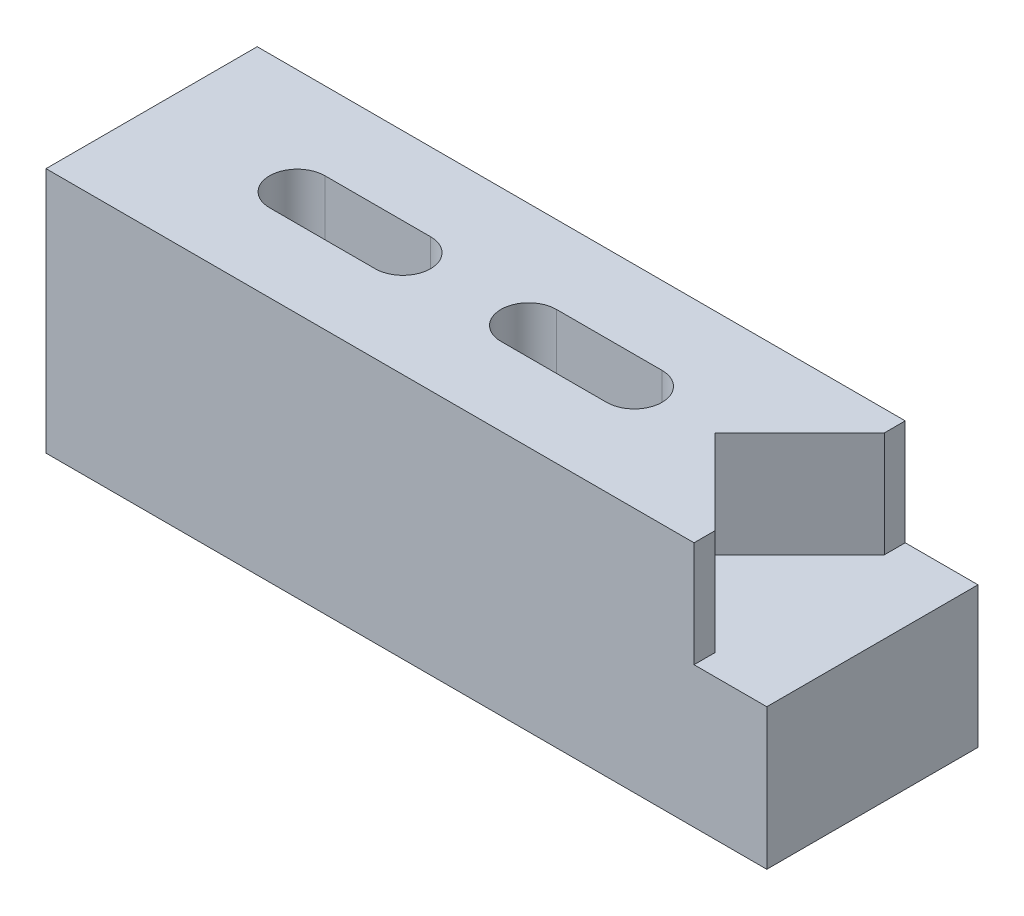
ISO-10303-21;
HEADER;
FILE_DESCRIPTION(('STEP AP214'),'2;1');
FILE_NAME('part.step','',(''),(''),'','','');
FILE_SCHEMA(('AUTOMOTIVE_DESIGN { 1 0 10303 214 1 1 1 1 }'));
ENDSEC;
DATA;
#1=APPLICATION_CONTEXT('core data for automotive mechanical design processes');
#2=APPLICATION_PROTOCOL_DEFINITION('international standard','automotive_design',2000,#1);
#3=PRODUCT_CONTEXT('',#1,'mechanical');
#4=PRODUCT('Part','Part','',(#3));
#5=PRODUCT_RELATED_PRODUCT_CATEGORY('part','',(#4));
#6=PRODUCT_DEFINITION_FORMATION('','',#4);
#7=PRODUCT_DEFINITION_CONTEXT('part definition',#1,'design');
#8=PRODUCT_DEFINITION('design','',#6,#7);
#9=PRODUCT_DEFINITION_SHAPE('','',#8);
#10=(LENGTH_UNIT() NAMED_UNIT(*) SI_UNIT(.MILLI.,.METRE.));
#11=(NAMED_UNIT(*) PLANE_ANGLE_UNIT() SI_UNIT($,.RADIAN.));
#12=(NAMED_UNIT(*) SI_UNIT($,.STERADIAN.) SOLID_ANGLE_UNIT());
#13=UNCERTAINTY_MEASURE_WITH_UNIT(LENGTH_MEASURE(1.E-05),#10,'distance_accuracy_value','');
#14=(GEOMETRIC_REPRESENTATION_CONTEXT(3) GLOBAL_UNCERTAINTY_ASSIGNED_CONTEXT((#13)) GLOBAL_UNIT_ASSIGNED_CONTEXT((#10,
#11,#12)) REPRESENTATION_CONTEXT('',''));
#15=CARTESIAN_POINT('',(0.,0.,0.));
#16=DIRECTION('',(0.,0.,1.));
#17=DIRECTION('',(1.,0.,0.));
#18=AXIS2_PLACEMENT_3D('',#15,#16,#17);
#19=CARTESIAN_POINT('',(0.,17.78,-15.24));
#20=DIRECTION('',(0.,1.,0.));
#21=DIRECTION('',(0.,0.,1.));
#22=AXIS2_PLACEMENT_3D('',#19,#20,#21);
#23=PLANE('',#22);
#24=DIRECTION('',(0.,0.,1.));
#25=VECTOR('',#24,1.);
#26=CARTESIAN_POINT('',(46.76,17.78,-15.24));
#27=LINE('',#26,#25);
#28=CARTESIAN_POINT('',(46.76,17.78,-15.24));
#29=VERTEX_POINT('',#28);
#30=CARTESIAN_POINT('',(46.76,17.78,-13.74));
#31=VERTEX_POINT('',#30);
#32=EDGE_CURVE('E154',#29,#31,#27,.T.);
#33=ORIENTED_EDGE('',*,*,#32,.F.);
#34=DIRECTION('',(-1.,0.,0.));
#35=VECTOR('',#34,1.);
#36=CARTESIAN_POINT('',(0.,17.78,-15.24));
#37=LINE('',#36,#35);
#38=CARTESIAN_POINT('',(0.,17.78,-15.24));
#39=VERTEX_POINT('',#38);
#40=EDGE_CURVE('E164',#29,#39,#37,.T.);
#41=ORIENTED_EDGE('',*,*,#40,.T.);
#42=DIRECTION('',(0.,0.,1.));
#43=VECTOR('',#42,1.);
#44=CARTESIAN_POINT('',(0.,17.78,-15.24));
#45=LINE('',#44,#43);
#46=CARTESIAN_POINT('',(0.,17.78,0.));
#47=VERTEX_POINT('',#46);
#48=EDGE_CURVE('E11',#39,#47,#45,.T.);
#49=ORIENTED_EDGE('',*,*,#48,.T.);
#50=DIRECTION('',(-1.,0.,0.));
#51=VECTOR('',#50,1.);
#52=CARTESIAN_POINT('',(0.,17.78,0.));
#53=LINE('',#52,#51);
#54=CARTESIAN_POINT('',(46.76,17.78,0.));
#55=VERTEX_POINT('',#54);
#56=EDGE_CURVE('E185',#55,#47,#53,.T.);
#57=ORIENTED_EDGE('',*,*,#56,.F.);
#58=DIRECTION('',(0.,0.,-1.));
#59=VECTOR('',#58,1.);
#60=CARTESIAN_POINT('',(46.76,17.78,0.));
#61=LINE('',#60,#59);
#62=CARTESIAN_POINT('',(46.76,17.78,-1.49999999999997));
#63=VERTEX_POINT('',#62);
#64=EDGE_CURVE('E283',#55,#63,#61,.T.);
#65=ORIENTED_EDGE('',*,*,#64,.T.);
#66=DIRECTION('',(0.707106781186549,0.,0.707106781186546));
#67=VECTOR('',#66,1.);
#68=CARTESIAN_POINT('',(40.64,17.78,-7.62));
#69=LINE('',#68,#67);
#70=CARTESIAN_POINT('',(40.64,17.78,-7.62));
#71=VERTEX_POINT('',#70);
#72=EDGE_CURVE('E194',#71,#63,#69,.T.);
#73=ORIENTED_EDGE('',*,*,#72,.F.);
#74=DIRECTION('',(-0.707106781186549,0.,0.707106781186546));
#75=VECTOR('',#74,1.);
#76=CARTESIAN_POINT('',(48.26,17.78,-15.24));
#77=LINE('',#76,#75);
#78=EDGE_CURVE('E167',#31,#71,#77,.T.);
#79=ORIENTED_EDGE('',*,*,#78,.F.);
#80=EDGE_LOOP('',(#33,#41,#49,#57,#65,#73,#79));
#81=FACE_BOUND('',#80,.T.);
#82=CARTESIAN_POINT('',(34.83,17.78,-7.62));
#83=DIRECTION('',(0.,1.,0.));
#84=DIRECTION('',(0.,0.,1.));
#85=AXIS2_PLACEMENT_3D('',#82,#83,#84);
#86=CIRCLE('',#85,2.);
#87=CARTESIAN_POINT('',(34.83,17.78,-5.62));
#88=VERTEX_POINT('',#87);
#89=CARTESIAN_POINT('',(34.83,17.78,-9.62));
#90=VERTEX_POINT('',#89);
#91=EDGE_CURVE('E56',#88,#90,#86,.T.);
#92=ORIENTED_EDGE('',*,*,#91,.F.);
#93=DIRECTION('',(1.,0.,0.));
#94=VECTOR('',#93,1.);
#95=CARTESIAN_POINT('',(34.83,17.78,-5.62));
#96=LINE('',#95,#94);
#97=CARTESIAN_POINT('',(27.21,17.78,-5.62));
#98=VERTEX_POINT('',#97);
#99=EDGE_CURVE('E244',#98,#88,#96,.T.);
#100=ORIENTED_EDGE('',*,*,#99,.F.);
#101=CARTESIAN_POINT('',(27.21,17.78,-7.62));
#102=DIRECTION('',(0.,1.,0.));
#103=DIRECTION('',(0.,0.,1.));
#104=AXIS2_PLACEMENT_3D('',#101,#102,#103);
#105=CIRCLE('',#104,2.);
#106=CARTESIAN_POINT('',(27.21,17.78,-9.62));
#107=VERTEX_POINT('',#106);
#108=EDGE_CURVE('E248',#107,#98,#105,.T.);
#109=ORIENTED_EDGE('',*,*,#108,.F.);
#110=DIRECTION('',(-1.,0.,0.));
#111=VECTOR('',#110,1.);
#112=CARTESIAN_POINT('',(34.83,17.78,-9.62));
#113=LINE('',#112,#111);
#114=EDGE_CURVE('E251',#90,#107,#113,.T.);
#115=ORIENTED_EDGE('',*,*,#114,.F.);
#116=EDGE_LOOP('',(#92,#100,#109,#115));
#117=FACE_BOUND('',#116,.T.);
#118=CARTESIAN_POINT('',(18.13,17.78,-7.62));
#119=DIRECTION('',(0.,1.,0.));
#120=DIRECTION('',(0.,0.,1.));
#121=AXIS2_PLACEMENT_3D('',#118,#119,#120);
#122=CIRCLE('',#121,2.);
#123=CARTESIAN_POINT('',(18.13,17.78,-5.62));
#124=VERTEX_POINT('',#123);
#125=CARTESIAN_POINT('',(18.13,17.78,-9.62));
#126=VERTEX_POINT('',#125);
#127=EDGE_CURVE('E223',#124,#126,#122,.T.);
#128=ORIENTED_EDGE('',*,*,#127,.F.);
#129=DIRECTION('',(1.,0.,0.));
#130=VECTOR('',#129,1.);
#131=CARTESIAN_POINT('',(18.13,17.78,-5.62));
#132=LINE('',#131,#130);
#133=CARTESIAN_POINT('',(10.51,17.78,-5.62));
#134=VERTEX_POINT('',#133);
#135=EDGE_CURVE('E213',#134,#124,#132,.T.);
#136=ORIENTED_EDGE('',*,*,#135,.F.);
#137=CARTESIAN_POINT('',(10.51,17.78,-7.62));
#138=DIRECTION('',(0.,1.,0.));
#139=DIRECTION('',(0.,0.,1.));
#140=AXIS2_PLACEMENT_3D('',#137,#138,#139);
#141=CIRCLE('',#140,2.);
#142=CARTESIAN_POINT('',(10.51,17.78,-9.62));
#143=VERTEX_POINT('',#142);
#144=EDGE_CURVE('E217',#143,#134,#141,.T.);
#145=ORIENTED_EDGE('',*,*,#144,.F.);
#146=DIRECTION('',(-1.,0.,0.));
#147=VECTOR('',#146,1.);
#148=CARTESIAN_POINT('',(18.13,17.78,-9.62));
#149=LINE('',#148,#147);
#150=EDGE_CURVE('E220',#126,#143,#149,.T.);
#151=ORIENTED_EDGE('',*,*,#150,.F.);
#152=EDGE_LOOP('',(#128,#136,#145,#151));
#153=FACE_BOUND('',#152,.T.);
#154=ADVANCED_FACE('F33',(#81,#117,#153),#23,.T.);
#155=CARTESIAN_POINT('',(0.,0.,0.));
#156=DIRECTION('',(0.,0.,-1.));
#157=DIRECTION('',(-1.,0.,0.));
#158=AXIS2_PLACEMENT_3D('',#155,#156,#157);
#159=PLANE('',#158);
#160=DIRECTION('',(0.,1.,0.));
#161=VECTOR('',#160,1.);
#162=CARTESIAN_POINT('',(46.76,8.03867965644039,0.));
#163=LINE('',#162,#161);
#164=CARTESIAN_POINT('',(46.76,10.16,0.));
#165=VERTEX_POINT('',#164);
#166=EDGE_CURVE('E279',#165,#55,#163,.T.);
#167=ORIENTED_EDGE('',*,*,#166,.T.);
#168=ORIENTED_EDGE('',*,*,#56,.T.);
#169=DIRECTION('',(0.,-1.,0.));
#170=VECTOR('',#169,1.);
#171=CARTESIAN_POINT('',(0.,0.,0.));
#172=LINE('',#171,#170);
#173=CARTESIAN_POINT('',(0.,0.,0.));
#174=VERTEX_POINT('',#173);
#175=EDGE_CURVE('E179',#47,#174,#172,.T.);
#176=ORIENTED_EDGE('',*,*,#175,.T.);
#177=DIRECTION('',(1.,0.,0.));
#178=VECTOR('',#177,1.);
#179=CARTESIAN_POINT('',(0.,0.,0.));
#180=LINE('',#179,#178);
#181=CARTESIAN_POINT('',(52.01,0.,0.));
#182=VERTEX_POINT('',#181);
#183=EDGE_CURVE('E182',#174,#182,#180,.T.);
#184=ORIENTED_EDGE('',*,*,#183,.T.);
#185=DIRECTION('',(0.,-1.,0.));
#186=VECTOR('',#185,1.);
#187=CARTESIAN_POINT('',(52.01,10.16,0.));
#188=LINE('',#187,#186);
#189=CARTESIAN_POINT('',(52.01,10.16,0.));
#190=VERTEX_POINT('',#189);
#191=EDGE_CURVE('E275',#190,#182,#188,.T.);
#192=ORIENTED_EDGE('',*,*,#191,.F.);
#193=DIRECTION('',(-1.,0.,0.));
#194=VECTOR('',#193,1.);
#195=CARTESIAN_POINT('',(52.01,10.16,0.));
#196=LINE('',#195,#194);
#197=EDGE_CURVE('E266',#190,#165,#196,.T.);
#198=ORIENTED_EDGE('',*,*,#197,.T.);
#199=EDGE_LOOP('',(#167,#168,#176,#184,#192,#198));
#200=FACE_BOUND('',#199,.T.);
#201=ADVANCED_FACE('F304',(#200),#159,.F.);
#202=CARTESIAN_POINT('',(40.64,10.16,-7.62));
#203=DIRECTION('',(-0.707106781186546,0.,0.707106781186549));
#204=DIRECTION('',(0.707106781186549,0.,0.707106781186546));
#205=AXIS2_PLACEMENT_3D('',#202,#203,#204);
#206=PLANE('',#205);
#207=DIRECTION('',(0.,1.,0.));
#208=VECTOR('',#207,1.);
#209=CARTESIAN_POINT('',(46.76,8.03867965644039,-1.49999999999997));
#210=LINE('',#209,#208);
#211=CARTESIAN_POINT('',(46.76,10.16,-1.49999999999997));
#212=VERTEX_POINT('',#211);
#213=EDGE_CURVE('E281',#212,#63,#210,.T.);
#214=ORIENTED_EDGE('',*,*,#213,.F.);
#215=DIRECTION('',(0.707106781186549,0.,0.707106781186546));
#216=VECTOR('',#215,1.);
#217=CARTESIAN_POINT('',(40.64,10.16,-7.62));
#218=LINE('',#217,#216);
#219=CARTESIAN_POINT('',(40.64,10.16,-7.62));
#220=VERTEX_POINT('',#219);
#221=EDGE_CURVE('E193',#220,#212,#218,.T.);
#222=ORIENTED_EDGE('',*,*,#221,.F.);
#223=DIRECTION('',(0.,1.,0.));
#224=VECTOR('',#223,1.);
#225=CARTESIAN_POINT('',(40.64,10.16,-7.62));
#226=LINE('',#225,#224);
#227=EDGE_CURVE('E183',#220,#71,#226,.T.);
#228=ORIENTED_EDGE('',*,*,#227,.T.);
#229=ORIENTED_EDGE('',*,*,#72,.T.);
#230=EDGE_LOOP('',(#214,#222,#228,#229));
#231=FACE_BOUND('',#230,.T.);
#232=ADVANCED_FACE('F298',(#231),#206,.F.);
#233=CARTESIAN_POINT('',(0.,0.,-15.24));
#234=DIRECTION('',(-1.,0.,0.));
#235=DIRECTION('',(0.,0.,1.));
#236=AXIS2_PLACEMENT_3D('',#233,#234,#235);
#237=PLANE('',#236);
#238=ORIENTED_EDGE('',*,*,#175,.F.);
#239=ORIENTED_EDGE('',*,*,#48,.F.);
#240=DIRECTION('',(0.,-1.,0.));
#241=VECTOR('',#240,1.);
#242=CARTESIAN_POINT('',(0.,0.,-15.24));
#243=LINE('',#242,#241);
#244=CARTESIAN_POINT('',(0.,0.,-15.24));
#245=VERTEX_POINT('',#244);
#246=EDGE_CURVE('E173',#39,#245,#243,.T.);
#247=ORIENTED_EDGE('',*,*,#246,.T.);
#248=DIRECTION('',(0.,0.,1.));
#249=VECTOR('',#248,1.);
#250=CARTESIAN_POINT('',(0.,0.,-15.24));
#251=LINE('',#250,#249);
#252=EDGE_CURVE('E37',#245,#174,#251,.T.);
#253=ORIENTED_EDGE('',*,*,#252,.T.);
#254=EDGE_LOOP('',(#238,#239,#247,#253));
#255=FACE_BOUND('',#254,.T.);
#256=ADVANCED_FACE('F35',(#255),#237,.T.);
#257=CARTESIAN_POINT('',(0.,0.,-15.24));
#258=DIRECTION('',(0.,-1.,0.));
#259=DIRECTION('',(0.,0.,-1.));
#260=AXIS2_PLACEMENT_3D('',#257,#258,#259);
#261=PLANE('',#260);
#262=CARTESIAN_POINT('',(34.83,0.,-7.62));
#263=DIRECTION('',(0.,1.,0.));
#264=DIRECTION('',(0.,0.,1.));
#265=AXIS2_PLACEMENT_3D('',#262,#263,#264);
#266=CIRCLE('',#265,2.);
#267=CARTESIAN_POINT('',(34.83,0.,-5.62));
#268=VERTEX_POINT('',#267);
#269=CARTESIAN_POINT('',(34.83,0.,-9.62));
#270=VERTEX_POINT('',#269);
#271=EDGE_CURVE('E247',#268,#270,#266,.T.);
#272=ORIENTED_EDGE('',*,*,#271,.T.);
#273=DIRECTION('',(-1.,0.,0.));
#274=VECTOR('',#273,1.);
#275=CARTESIAN_POINT('',(34.83,0.,-9.62));
#276=LINE('',#275,#274);
#277=CARTESIAN_POINT('',(27.21,0.,-9.62));
#278=VERTEX_POINT('',#277);
#279=EDGE_CURVE('E260',#270,#278,#276,.T.);
#280=ORIENTED_EDGE('',*,*,#279,.T.);
#281=CARTESIAN_POINT('',(27.21,0.,-7.62));
#282=DIRECTION('',(0.,1.,0.));
#283=DIRECTION('',(0.,0.,1.));
#284=AXIS2_PLACEMENT_3D('',#281,#282,#283);
#285=CIRCLE('',#284,2.);
#286=CARTESIAN_POINT('',(27.21,0.,-5.62));
#287=VERTEX_POINT('',#286);
#288=EDGE_CURVE('E257',#278,#287,#285,.T.);
#289=ORIENTED_EDGE('',*,*,#288,.T.);
#290=DIRECTION('',(1.,0.,0.));
#291=VECTOR('',#290,1.);
#292=CARTESIAN_POINT('',(34.83,0.,-5.62));
#293=LINE('',#292,#291);
#294=EDGE_CURVE('E239',#287,#268,#293,.T.);
#295=ORIENTED_EDGE('',*,*,#294,.T.);
#296=EDGE_LOOP('',(#272,#280,#289,#295));
#297=FACE_BOUND('',#296,.T.);
#298=CARTESIAN_POINT('',(18.13,0.,-7.62));
#299=DIRECTION('',(0.,1.,0.));
#300=DIRECTION('',(0.,0.,1.));
#301=AXIS2_PLACEMENT_3D('',#298,#299,#300);
#302=CIRCLE('',#301,2.);
#303=CARTESIAN_POINT('',(18.13,0.,-5.62));
#304=VERTEX_POINT('',#303);
#305=CARTESIAN_POINT('',(18.13,0.,-9.62));
#306=VERTEX_POINT('',#305);
#307=EDGE_CURVE('E216',#304,#306,#302,.T.);
#308=ORIENTED_EDGE('',*,*,#307,.T.);
#309=DIRECTION('',(-1.,0.,0.));
#310=VECTOR('',#309,1.);
#311=CARTESIAN_POINT('',(18.13,0.,-9.62));
#312=LINE('',#311,#310);
#313=CARTESIAN_POINT('',(10.51,0.,-9.62));
#314=VERTEX_POINT('',#313);
#315=EDGE_CURVE('E231',#306,#314,#312,.T.);
#316=ORIENTED_EDGE('',*,*,#315,.T.);
#317=CARTESIAN_POINT('',(10.51,0.,-7.62));
#318=DIRECTION('',(0.,1.,0.));
#319=DIRECTION('',(0.,0.,1.));
#320=AXIS2_PLACEMENT_3D('',#317,#318,#319);
#321=CIRCLE('',#320,2.);
#322=CARTESIAN_POINT('',(10.51,0.,-5.62));
#323=VERTEX_POINT('',#322);
#324=EDGE_CURVE('E228',#314,#323,#321,.T.);
#325=ORIENTED_EDGE('',*,*,#324,.T.);
#326=DIRECTION('',(1.,0.,0.));
#327=VECTOR('',#326,1.);
#328=CARTESIAN_POINT('',(18.13,0.,-5.62));
#329=LINE('',#328,#327);
#330=EDGE_CURVE('E207',#323,#304,#329,.T.);
#331=ORIENTED_EDGE('',*,*,#330,.T.);
#332=EDGE_LOOP('',(#308,#316,#325,#331));
#333=FACE_BOUND('',#332,.T.);
#334=ORIENTED_EDGE('',*,*,#183,.F.);
#335=ORIENTED_EDGE('',*,*,#252,.F.);
#336=DIRECTION('',(1.,0.,0.));
#337=VECTOR('',#336,1.);
#338=CARTESIAN_POINT('',(0.,0.,-15.24));
#339=LINE('',#338,#337);
#340=CARTESIAN_POINT('',(52.01,0.,-15.24));
#341=VERTEX_POINT('',#340);
#342=EDGE_CURVE('E174',#245,#341,#339,.T.);
#343=ORIENTED_EDGE('',*,*,#342,.T.);
#344=DIRECTION('',(0.,0.,-1.));
#345=VECTOR('',#344,1.);
#346=CARTESIAN_POINT('',(52.01,0.,0.));
#347=LINE('',#346,#345);
#348=EDGE_CURVE('E272',#182,#341,#347,.T.);
#349=ORIENTED_EDGE('',*,*,#348,.F.);
#350=EDGE_LOOP('',(#334,#335,#343,#349));
#351=FACE_BOUND('',#350,.T.);
#352=ADVANCED_FACE('F308',(#297,#333,#351),#261,.T.);
#353=CARTESIAN_POINT('',(0.,0.,-15.24));
#354=DIRECTION('',(0.,0.,-1.));
#355=DIRECTION('',(-1.,0.,0.));
#356=AXIS2_PLACEMENT_3D('',#353,#354,#355);
#357=PLANE('',#356);
#358=DIRECTION('',(0.,1.,0.));
#359=VECTOR('',#358,1.);
#360=CARTESIAN_POINT('',(46.76,8.03867965644037,-15.24));
#361=LINE('',#360,#359);
#362=CARTESIAN_POINT('',(46.76,10.16,-15.24));
#363=VERTEX_POINT('',#362);
#364=EDGE_CURVE('E151',#363,#29,#361,.T.);
#365=ORIENTED_EDGE('',*,*,#364,.F.);
#366=DIRECTION('',(-1.,0.,0.));
#367=VECTOR('',#366,1.);
#368=CARTESIAN_POINT('',(52.01,10.16,-15.24));
#369=LINE('',#368,#367);
#370=CARTESIAN_POINT('',(52.01,10.16,-15.24));
#371=VERTEX_POINT('',#370);
#372=EDGE_CURVE('E225',#371,#363,#369,.T.);
#373=ORIENTED_EDGE('',*,*,#372,.F.);
#374=DIRECTION('',(0.,1.,0.));
#375=VECTOR('',#374,1.);
#376=CARTESIAN_POINT('',(52.01,10.16,-15.24));
#377=LINE('',#376,#375);
#378=EDGE_CURVE('E270',#341,#371,#377,.T.);
#379=ORIENTED_EDGE('',*,*,#378,.F.);
#380=ORIENTED_EDGE('',*,*,#342,.F.);
#381=ORIENTED_EDGE('',*,*,#246,.F.);
#382=ORIENTED_EDGE('',*,*,#40,.F.);
#383=EDGE_LOOP('',(#365,#373,#379,#380,#381,#382));
#384=FACE_BOUND('',#383,.T.);
#385=ADVANCED_FACE('F170',(#384),#357,.T.);
#386=CARTESIAN_POINT('',(48.26,10.16,-15.24));
#387=DIRECTION('',(-0.707106781186546,0.,-0.707106781186549));
#388=DIRECTION('',(-0.707106781186549,0.,0.707106781186546));
#389=AXIS2_PLACEMENT_3D('',#386,#387,#388);
#390=PLANE('',#389);
#391=DIRECTION('',(-0.707106781186549,0.,0.707106781186546));
#392=VECTOR('',#391,1.);
#393=CARTESIAN_POINT('',(48.26,10.16,-15.24));
#394=LINE('',#393,#392);
#395=CARTESIAN_POINT('',(46.76,10.16,-13.74));
#396=VERTEX_POINT('',#395);
#397=EDGE_CURVE('E197',#396,#220,#394,.T.);
#398=ORIENTED_EDGE('',*,*,#397,.F.);
#399=DIRECTION('',(0.,1.,0.));
#400=VECTOR('',#399,1.);
#401=CARTESIAN_POINT('',(46.76,8.03867965644037,-13.74));
#402=LINE('',#401,#400);
#403=EDGE_CURVE('E159',#396,#31,#402,.T.);
#404=ORIENTED_EDGE('',*,*,#403,.T.);
#405=ORIENTED_EDGE('',*,*,#78,.T.);
#406=ORIENTED_EDGE('',*,*,#227,.F.);
#407=EDGE_LOOP('',(#398,#404,#405,#406));
#408=FACE_BOUND('',#407,.T.);
#409=ADVANCED_FACE('F291',(#408),#390,.F.);
#410=CARTESIAN_POINT('',(0.,10.16,0.));
#411=DIRECTION('',(0.,1.,0.));
#412=DIRECTION('',(0.,0.,1.));
#413=AXIS2_PLACEMENT_3D('',#410,#411,#412);
#414=PLANE('',#413);
#415=ORIENTED_EDGE('',*,*,#221,.T.);
#416=DIRECTION('',(0.,0.,1.));
#417=VECTOR('',#416,1.);
#418=CARTESIAN_POINT('',(46.76,10.16,0.));
#419=LINE('',#418,#417);
#420=EDGE_CURVE('E278',#212,#165,#419,.T.);
#421=ORIENTED_EDGE('',*,*,#420,.T.);
#422=ORIENTED_EDGE('',*,*,#197,.F.);
#423=DIRECTION('',(0.,0.,1.));
#424=VECTOR('',#423,1.);
#425=CARTESIAN_POINT('',(52.01,10.16,0.));
#426=LINE('',#425,#424);
#427=EDGE_CURVE('E268',#371,#190,#426,.T.);
#428=ORIENTED_EDGE('',*,*,#427,.F.);
#429=ORIENTED_EDGE('',*,*,#372,.T.);
#430=DIRECTION('',(0.,0.,-1.));
#431=VECTOR('',#430,1.);
#432=CARTESIAN_POINT('',(46.76,10.16,-15.24));
#433=LINE('',#432,#431);
#434=EDGE_CURVE('E48',#396,#363,#433,.T.);
#435=ORIENTED_EDGE('',*,*,#434,.F.);
#436=ORIENTED_EDGE('',*,*,#397,.T.);
#437=EDGE_LOOP('',(#415,#421,#422,#428,#429,#435,#436));
#438=FACE_BOUND('',#437,.T.);
#439=ADVANCED_FACE('F294',(#438),#414,.T.);
#440=CARTESIAN_POINT('',(18.13,0.,-7.62));
#441=DIRECTION('',(0.,1.,0.));
#442=DIRECTION('',(0.,0.,1.));
#443=AXIS2_PLACEMENT_3D('',#440,#441,#442);
#444=CYLINDRICAL_SURFACE('',#443,2.);
#445=ORIENTED_EDGE('',*,*,#127,.T.);
#446=DIRECTION('',(0.,1.,0.));
#447=VECTOR('',#446,1.);
#448=CARTESIAN_POINT('',(18.13,0.,-9.62));
#449=LINE('',#448,#447);
#450=EDGE_CURVE('E203',#306,#126,#449,.T.);
#451=ORIENTED_EDGE('',*,*,#450,.F.);
#452=ORIENTED_EDGE('',*,*,#307,.F.);
#453=DIRECTION('',(0.,1.,0.));
#454=VECTOR('',#453,1.);
#455=CARTESIAN_POINT('',(18.13,0.,-5.62));
#456=LINE('',#455,#454);
#457=EDGE_CURVE('E211',#304,#124,#456,.T.);
#458=ORIENTED_EDGE('',*,*,#457,.T.);
#459=EDGE_LOOP('',(#445,#451,#452,#458));
#460=FACE_BOUND('',#459,.T.);
#461=ADVANCED_FACE('F347',(#460),#444,.F.);
#462=CARTESIAN_POINT('',(18.13,0.,-5.62));
#463=DIRECTION('',(0.,0.,1.));
#464=DIRECTION('',(1.,0.,0.));
#465=AXIS2_PLACEMENT_3D('',#462,#463,#464);
#466=PLANE('',#465);
#467=ORIENTED_EDGE('',*,*,#135,.T.);
#468=ORIENTED_EDGE('',*,*,#457,.F.);
#469=ORIENTED_EDGE('',*,*,#330,.F.);
#470=DIRECTION('',(0.,1.,0.));
#471=VECTOR('',#470,1.);
#472=CARTESIAN_POINT('',(10.51,0.,-5.62));
#473=LINE('',#472,#471);
#474=EDGE_CURVE('E209',#323,#134,#473,.T.);
#475=ORIENTED_EDGE('',*,*,#474,.T.);
#476=EDGE_LOOP('',(#467,#468,#469,#475));
#477=FACE_BOUND('',#476,.T.);
#478=ADVANCED_FACE('F358',(#477),#466,.F.);
#479=CARTESIAN_POINT('',(10.51,0.,-7.62));
#480=DIRECTION('',(0.,1.,0.));
#481=DIRECTION('',(0.,0.,1.));
#482=AXIS2_PLACEMENT_3D('',#479,#480,#481);
#483=CYLINDRICAL_SURFACE('',#482,2.);
#484=ORIENTED_EDGE('',*,*,#144,.T.);
#485=ORIENTED_EDGE('',*,*,#474,.F.);
#486=ORIENTED_EDGE('',*,*,#324,.F.);
#487=DIRECTION('',(0.,1.,0.));
#488=VECTOR('',#487,1.);
#489=CARTESIAN_POINT('',(10.51,0.,-9.62));
#490=LINE('',#489,#488);
#491=EDGE_CURVE('E206',#314,#143,#490,.T.);
#492=ORIENTED_EDGE('',*,*,#491,.T.);
#493=EDGE_LOOP('',(#484,#485,#486,#492));
#494=FACE_BOUND('',#493,.T.);
#495=ADVANCED_FACE('F355',(#494),#483,.F.);
#496=CARTESIAN_POINT('',(18.13,0.,-9.62));
#497=DIRECTION('',(0.,0.,-1.));
#498=DIRECTION('',(-1.,0.,0.));
#499=AXIS2_PLACEMENT_3D('',#496,#497,#498);
#500=PLANE('',#499);
#501=ORIENTED_EDGE('',*,*,#150,.T.);
#502=ORIENTED_EDGE('',*,*,#491,.F.);
#503=ORIENTED_EDGE('',*,*,#315,.F.);
#504=ORIENTED_EDGE('',*,*,#450,.T.);
#505=EDGE_LOOP('',(#501,#502,#503,#504));
#506=FACE_BOUND('',#505,.T.);
#507=ADVANCED_FACE('F352',(#506),#500,.F.);
#508=CARTESIAN_POINT('',(34.83,0.,-7.62));
#509=DIRECTION('',(0.,1.,0.));
#510=DIRECTION('',(0.,0.,1.));
#511=AXIS2_PLACEMENT_3D('',#508,#509,#510);
#512=CYLINDRICAL_SURFACE('',#511,2.);
#513=ORIENTED_EDGE('',*,*,#91,.T.);
#514=DIRECTION('',(0.,1.,0.));
#515=VECTOR('',#514,1.);
#516=CARTESIAN_POINT('',(34.83,0.,-9.62));
#517=LINE('',#516,#515);
#518=EDGE_CURVE('E236',#270,#90,#517,.T.);
#519=ORIENTED_EDGE('',*,*,#518,.F.);
#520=ORIENTED_EDGE('',*,*,#271,.F.);
#521=DIRECTION('',(0.,1.,0.));
#522=VECTOR('',#521,1.);
#523=CARTESIAN_POINT('',(34.83,0.,-5.62));
#524=LINE('',#523,#522);
#525=EDGE_CURVE('E199',#268,#88,#524,.T.);
#526=ORIENTED_EDGE('',*,*,#525,.T.);
#527=EDGE_LOOP('',(#513,#519,#520,#526));
#528=FACE_BOUND('',#527,.T.);
#529=ADVANCED_FACE('F369',(#528),#512,.F.);
#530=CARTESIAN_POINT('',(34.83,0.,-5.62));
#531=DIRECTION('',(0.,0.,1.));
#532=DIRECTION('',(1.,0.,0.));
#533=AXIS2_PLACEMENT_3D('',#530,#531,#532);
#534=PLANE('',#533);
#535=ORIENTED_EDGE('',*,*,#99,.T.);
#536=ORIENTED_EDGE('',*,*,#525,.F.);
#537=ORIENTED_EDGE('',*,*,#294,.F.);
#538=DIRECTION('',(0.,1.,0.));
#539=VECTOR('',#538,1.);
#540=CARTESIAN_POINT('',(27.21,0.,-5.62));
#541=LINE('',#540,#539);
#542=EDGE_CURVE('E241',#287,#98,#541,.T.);
#543=ORIENTED_EDGE('',*,*,#542,.T.);
#544=EDGE_LOOP('',(#535,#536,#537,#543));
#545=FACE_BOUND('',#544,.T.);
#546=ADVANCED_FACE('F437',(#545),#534,.F.);
#547=CARTESIAN_POINT('',(27.21,0.,-7.62));
#548=DIRECTION('',(0.,1.,0.));
#549=DIRECTION('',(0.,0.,1.));
#550=AXIS2_PLACEMENT_3D('',#547,#548,#549);
#551=CYLINDRICAL_SURFACE('',#550,2.);
#552=ORIENTED_EDGE('',*,*,#108,.T.);
#553=ORIENTED_EDGE('',*,*,#542,.F.);
#554=ORIENTED_EDGE('',*,*,#288,.F.);
#555=DIRECTION('',(0.,1.,0.));
#556=VECTOR('',#555,1.);
#557=CARTESIAN_POINT('',(27.21,0.,-9.62));
#558=LINE('',#557,#556);
#559=EDGE_CURVE('E238',#278,#107,#558,.T.);
#560=ORIENTED_EDGE('',*,*,#559,.T.);
#561=EDGE_LOOP('',(#552,#553,#554,#560));
#562=FACE_BOUND('',#561,.T.);
#563=ADVANCED_FACE('F322',(#562),#551,.F.);
#564=CARTESIAN_POINT('',(34.83,0.,-9.62));
#565=DIRECTION('',(0.,0.,-1.));
#566=DIRECTION('',(-1.,0.,0.));
#567=AXIS2_PLACEMENT_3D('',#564,#565,#566);
#568=PLANE('',#567);
#569=ORIENTED_EDGE('',*,*,#114,.T.);
#570=ORIENTED_EDGE('',*,*,#559,.F.);
#571=ORIENTED_EDGE('',*,*,#279,.F.);
#572=ORIENTED_EDGE('',*,*,#518,.T.);
#573=EDGE_LOOP('',(#569,#570,#571,#572));
#574=FACE_BOUND('',#573,.T.);
#575=ADVANCED_FACE('F314',(#574),#568,.F.);
#576=CARTESIAN_POINT('',(52.01,0.,0.));
#577=DIRECTION('',(1.,0.,0.));
#578=DIRECTION('',(0.,0.,-1.));
#579=AXIS2_PLACEMENT_3D('',#576,#577,#578);
#580=PLANE('',#579);
#581=ORIENTED_EDGE('',*,*,#191,.T.);
#582=ORIENTED_EDGE('',*,*,#348,.T.);
#583=ORIENTED_EDGE('',*,*,#378,.T.);
#584=ORIENTED_EDGE('',*,*,#427,.T.);
#585=EDGE_LOOP('',(#581,#582,#583,#584));
#586=FACE_BOUND('',#585,.T.);
#587=ADVANCED_FACE('F311',(#586),#580,.T.);
#588=CARTESIAN_POINT('',(46.76,8.03867965644039,0.));
#589=DIRECTION('',(1.,0.,0.));
#590=DIRECTION('',(0.,0.,-1.));
#591=AXIS2_PLACEMENT_3D('',#588,#589,#590);
#592=PLANE('',#591);
#593=ORIENTED_EDGE('',*,*,#213,.T.);
#594=ORIENTED_EDGE('',*,*,#64,.F.);
#595=ORIENTED_EDGE('',*,*,#166,.F.);
#596=ORIENTED_EDGE('',*,*,#420,.F.);
#597=EDGE_LOOP('',(#593,#594,#595,#596));
#598=FACE_BOUND('',#597,.T.);
#599=ADVANCED_FACE('F300',(#598),#592,.T.);
#600=CARTESIAN_POINT('',(46.76,8.03867965644037,-15.24));
#601=DIRECTION('',(-1.,0.,0.));
#602=DIRECTION('',(0.,0.,1.));
#603=AXIS2_PLACEMENT_3D('',#600,#601,#602);
#604=PLANE('',#603);
#605=ORIENTED_EDGE('',*,*,#434,.T.);
#606=ORIENTED_EDGE('',*,*,#364,.T.);
#607=ORIENTED_EDGE('',*,*,#32,.T.);
#608=ORIENTED_EDGE('',*,*,#403,.F.);
#609=EDGE_LOOP('',(#605,#606,#607,#608));
#610=FACE_BOUND('',#609,.T.);
#611=ADVANCED_FACE('F153',(#610),#604,.F.);
#612=CLOSED_SHELL('',(#154,#201,#232,#256,#352,#385,#409,#439,#461,#478,#495,#507,#529,#546,
#563,#575,#587,#599,#611));
#613=MANIFOLD_SOLID_BREP('B2',#612);
#614=ADVANCED_BREP_SHAPE_REPRESENTATION('',(#18,#613),#14);
#615=SHAPE_DEFINITION_REPRESENTATION(#9,#614);
ENDSEC;
END-ISO-10303-21;
